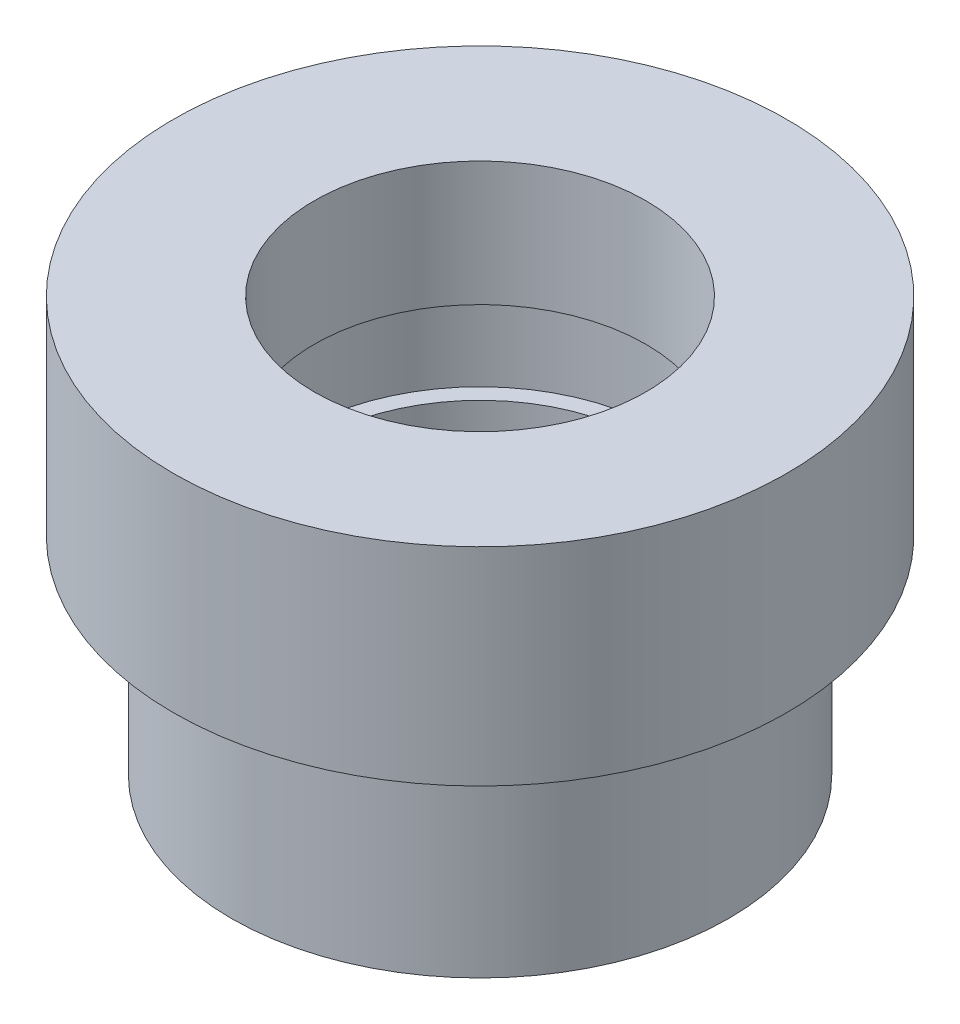
ISO-10303-21;
HEADER;
FILE_DESCRIPTION(('STEP AP214'),'2;1');
FILE_NAME('part.step','',(''),(''),'','','');
FILE_SCHEMA(('AUTOMOTIVE_DESIGN { 1 0 10303 214 1 1 1 1 }'));
ENDSEC;
DATA;
#1=APPLICATION_CONTEXT('core data for automotive mechanical design processes');
#2=APPLICATION_PROTOCOL_DEFINITION('international standard','automotive_design',2000,#1);
#3=PRODUCT_CONTEXT('',#1,'mechanical');
#4=PRODUCT('Part','Part','',(#3));
#5=PRODUCT_RELATED_PRODUCT_CATEGORY('part','',(#4));
#6=PRODUCT_DEFINITION_FORMATION('','',#4);
#7=PRODUCT_DEFINITION_CONTEXT('part definition',#1,'design');
#8=PRODUCT_DEFINITION('design','',#6,#7);
#9=PRODUCT_DEFINITION_SHAPE('','',#8);
#10=(LENGTH_UNIT() NAMED_UNIT(*) SI_UNIT(.MILLI.,.METRE.));
#11=(NAMED_UNIT(*) PLANE_ANGLE_UNIT() SI_UNIT($,.RADIAN.));
#12=(NAMED_UNIT(*) SI_UNIT($,.STERADIAN.) SOLID_ANGLE_UNIT());
#13=UNCERTAINTY_MEASURE_WITH_UNIT(LENGTH_MEASURE(1.E-05),#10,'distance_accuracy_value','');
#14=(GEOMETRIC_REPRESENTATION_CONTEXT(3) GLOBAL_UNCERTAINTY_ASSIGNED_CONTEXT((#13)) GLOBAL_UNIT_ASSIGNED_CONTEXT((#10,
#11,#12)) REPRESENTATION_CONTEXT('',''));
#15=CARTESIAN_POINT('',(0.,0.,0.));
#16=DIRECTION('',(0.,0.,1.));
#17=DIRECTION('',(1.,0.,0.));
#18=AXIS2_PLACEMENT_3D('',#15,#16,#17);
#19=CARTESIAN_POINT('',(30.,25.,-2.09488880330588E-13));
#20=DIRECTION('',(0.,1.,0.));
#21=DIRECTION('',(0.,0.,1.));
#22=AXIS2_PLACEMENT_3D('',#19,#20,#21);
#23=PLANE('',#22);
#24=CARTESIAN_POINT('',(0.,25.,0.));
#25=DIRECTION('',(0.,1.,0.));
#26=DIRECTION('',(0.,0.,1.));
#27=AXIS2_PLACEMENT_3D('',#24,#25,#26);
#28=CIRCLE('',#27,37.);
#29=CARTESIAN_POINT('',(0.,25.,37.));
#30=VERTEX_POINT('',#29);
#31=EDGE_CURVE('E10',#30,#30,#28,.T.);
#32=ORIENTED_EDGE('',*,*,#31,.F.);
#33=EDGE_LOOP('',(#32));
#34=FACE_BOUND('',#33,.T.);
#35=CARTESIAN_POINT('',(0.,25.,0.));
#36=DIRECTION('',(0.,1.,0.));
#37=DIRECTION('',(0.,0.,1.));
#38=AXIS2_PLACEMENT_3D('',#35,#36,#37);
#39=CIRCLE('',#38,30.);
#40=CARTESIAN_POINT('',(0.,25.,30.));
#41=VERTEX_POINT('',#40);
#42=EDGE_CURVE('E80',#41,#41,#39,.T.);
#43=ORIENTED_EDGE('',*,*,#42,.T.);
#44=EDGE_LOOP('',(#43));
#45=FACE_BOUND('',#44,.T.);
#46=ADVANCED_FACE('F37',(#34,#45),#23,.F.);
#47=CARTESIAN_POINT('',(0.,23.7378640776699,0.));
#48=DIRECTION('',(0.,1.,0.));
#49=DIRECTION('',(0.,0.,1.));
#50=AXIS2_PLACEMENT_3D('',#47,#48,#49);
#51=CYLINDRICAL_SURFACE('',#50,37.);
#52=CARTESIAN_POINT('',(0.,50.,0.));
#53=DIRECTION('',(0.,1.,0.));
#54=DIRECTION('',(0.,0.,1.));
#55=AXIS2_PLACEMENT_3D('',#52,#53,#54);
#56=CIRCLE('',#55,37.);
#57=CARTESIAN_POINT('',(0.,50.,37.));
#58=VERTEX_POINT('',#57);
#59=EDGE_CURVE('E44',#58,#58,#56,.T.);
#60=ORIENTED_EDGE('',*,*,#59,.F.);
#61=EDGE_LOOP('',(#60));
#62=FACE_BOUND('',#61,.T.);
#63=ORIENTED_EDGE('',*,*,#31,.T.);
#64=EDGE_LOOP('',(#63));
#65=FACE_BOUND('',#64,.T.);
#66=ADVANCED_FACE('F130',(#62,#65),#51,.T.);
#67=CARTESIAN_POINT('',(37.,50.,-2.58369619074392E-13));
#68=DIRECTION('',(0.,-1.,0.));
#69=DIRECTION('',(0.,0.,-1.));
#70=AXIS2_PLACEMENT_3D('',#67,#68,#69);
#71=PLANE('',#70);
#72=CARTESIAN_POINT('',(0.,50.,0.));
#73=DIRECTION('',(0.,1.,0.));
#74=DIRECTION('',(0.,0.,1.));
#75=AXIS2_PLACEMENT_3D('',#72,#73,#74);
#76=CIRCLE('',#75,20.);
#77=CARTESIAN_POINT('',(0.,50.,20.));
#78=VERTEX_POINT('',#77);
#79=EDGE_CURVE('E49',#78,#78,#76,.T.);
#80=ORIENTED_EDGE('',*,*,#79,.F.);
#81=EDGE_LOOP('',(#80));
#82=FACE_BOUND('',#81,.T.);
#83=ORIENTED_EDGE('',*,*,#59,.T.);
#84=EDGE_LOOP('',(#83));
#85=FACE_BOUND('',#84,.T.);
#86=ADVANCED_FACE('F125',(#82,#85),#71,.F.);
#87=CARTESIAN_POINT('',(0.,23.7378640776699,0.));
#88=DIRECTION('',(0.,1.,0.));
#89=DIRECTION('',(0.,0.,1.));
#90=AXIS2_PLACEMENT_3D('',#87,#88,#89);
#91=CYLINDRICAL_SURFACE('',#90,20.);
#92=CARTESIAN_POINT('',(0.,35.,0.));
#93=DIRECTION('',(0.,1.,0.));
#94=DIRECTION('',(0.,0.,1.));
#95=AXIS2_PLACEMENT_3D('',#92,#93,#94);
#96=CIRCLE('',#95,20.);
#97=CARTESIAN_POINT('',(0.,35.,20.));
#98=VERTEX_POINT('',#97);
#99=EDGE_CURVE('E54',#98,#98,#96,.T.);
#100=ORIENTED_EDGE('',*,*,#99,.F.);
#101=EDGE_LOOP('',(#100));
#102=FACE_BOUND('',#101,.T.);
#103=ORIENTED_EDGE('',*,*,#79,.T.);
#104=EDGE_LOOP('',(#103));
#105=FACE_BOUND('',#104,.T.);
#106=ADVANCED_FACE('F119',(#102,#105),#91,.F.);
#107=CARTESIAN_POINT('',(20.,35.,-1.39659253553725E-13));
#108=DIRECTION('',(0.,1.,0.));
#109=DIRECTION('',(0.,0.,1.));
#110=AXIS2_PLACEMENT_3D('',#107,#108,#109);
#111=PLANE('',#110);
#112=CARTESIAN_POINT('',(0.,35.,0.));
#113=DIRECTION('',(0.,1.,0.));
#114=DIRECTION('',(0.,0.,1.));
#115=AXIS2_PLACEMENT_3D('',#112,#113,#114);
#116=CIRCLE('',#115,22.);
#117=CARTESIAN_POINT('',(0.,35.,22.));
#118=VERTEX_POINT('',#117);
#119=EDGE_CURVE('E60',#118,#118,#116,.T.);
#120=ORIENTED_EDGE('',*,*,#119,.F.);
#121=EDGE_LOOP('',(#120));
#122=FACE_BOUND('',#121,.T.);
#123=ORIENTED_EDGE('',*,*,#99,.T.);
#124=EDGE_LOOP('',(#123));
#125=FACE_BOUND('',#124,.T.);
#126=ADVANCED_FACE('F113',(#122,#125),#111,.F.);
#127=CARTESIAN_POINT('',(0.,23.7378640776699,0.));
#128=DIRECTION('',(0.,1.,0.));
#129=DIRECTION('',(0.,0.,1.));
#130=AXIS2_PLACEMENT_3D('',#127,#128,#129);
#131=CYLINDRICAL_SURFACE('',#130,22.);
#132=CARTESIAN_POINT('',(0.,25.,0.));
#133=DIRECTION('',(0.,1.,0.));
#134=DIRECTION('',(0.,0.,1.));
#135=AXIS2_PLACEMENT_3D('',#132,#133,#134);
#136=CIRCLE('',#135,22.);
#137=CARTESIAN_POINT('',(0.,25.,22.));
#138=VERTEX_POINT('',#137);
#139=EDGE_CURVE('E64',#138,#138,#136,.T.);
#140=ORIENTED_EDGE('',*,*,#139,.F.);
#141=EDGE_LOOP('',(#140));
#142=FACE_BOUND('',#141,.T.);
#143=ORIENTED_EDGE('',*,*,#119,.T.);
#144=EDGE_LOOP('',(#143));
#145=FACE_BOUND('',#144,.T.);
#146=ADVANCED_FACE('F107',(#142,#145),#131,.F.);
#147=CARTESIAN_POINT('',(22.,25.,-1.53625178909098E-13));
#148=DIRECTION('',(0.,-1.,0.));
#149=DIRECTION('',(0.,0.,-1.));
#150=AXIS2_PLACEMENT_3D('',#147,#148,#149);
#151=PLANE('',#150);
#152=CARTESIAN_POINT('',(0.,25.,0.));
#153=DIRECTION('',(0.,1.,0.));
#154=DIRECTION('',(0.,0.,1.));
#155=AXIS2_PLACEMENT_3D('',#152,#153,#154);
#156=CIRCLE('',#155,20.);
#157=CARTESIAN_POINT('',(0.,25.,20.));
#158=VERTEX_POINT('',#157);
#159=EDGE_CURVE('E68',#158,#158,#156,.T.);
#160=ORIENTED_EDGE('',*,*,#159,.F.);
#161=EDGE_LOOP('',(#160));
#162=FACE_BOUND('',#161,.T.);
#163=ORIENTED_EDGE('',*,*,#139,.T.);
#164=EDGE_LOOP('',(#163));
#165=FACE_BOUND('',#164,.T.);
#166=ADVANCED_FACE('F101',(#162,#165),#151,.F.);
#167=CARTESIAN_POINT('',(0.,23.7378640776699,0.));
#168=DIRECTION('',(0.,1.,0.));
#169=DIRECTION('',(0.,0.,1.));
#170=AXIS2_PLACEMENT_3D('',#167,#168,#169);
#171=CYLINDRICAL_SURFACE('',#170,20.);
#172=CARTESIAN_POINT('',(0.,0.,0.));
#173=DIRECTION('',(0.,1.,0.));
#174=DIRECTION('',(0.,0.,1.));
#175=AXIS2_PLACEMENT_3D('',#172,#173,#174);
#176=CIRCLE('',#175,20.);
#177=CARTESIAN_POINT('',(0.,0.,20.));
#178=VERTEX_POINT('',#177);
#179=EDGE_CURVE('E72',#178,#178,#176,.T.);
#180=ORIENTED_EDGE('',*,*,#179,.F.);
#181=EDGE_LOOP('',(#180));
#182=FACE_BOUND('',#181,.T.);
#183=ORIENTED_EDGE('',*,*,#159,.T.);
#184=EDGE_LOOP('',(#183));
#185=FACE_BOUND('',#184,.T.);
#186=ADVANCED_FACE('F95',(#182,#185),#171,.F.);
#187=CARTESIAN_POINT('',(20.,0.,-1.39659253553725E-13));
#188=DIRECTION('',(0.,1.,0.));
#189=DIRECTION('',(0.,0.,1.));
#190=AXIS2_PLACEMENT_3D('',#187,#188,#189);
#191=PLANE('',#190);
#192=CARTESIAN_POINT('',(0.,0.,0.));
#193=DIRECTION('',(0.,1.,0.));
#194=DIRECTION('',(0.,0.,1.));
#195=AXIS2_PLACEMENT_3D('',#192,#193,#194);
#196=CIRCLE('',#195,30.);
#197=CARTESIAN_POINT('',(0.,0.,30.));
#198=VERTEX_POINT('',#197);
#199=EDGE_CURVE('E76',#198,#198,#196,.T.);
#200=ORIENTED_EDGE('',*,*,#199,.F.);
#201=EDGE_LOOP('',(#200));
#202=FACE_BOUND('',#201,.T.);
#203=ORIENTED_EDGE('',*,*,#179,.T.);
#204=EDGE_LOOP('',(#203));
#205=FACE_BOUND('',#204,.T.);
#206=ADVANCED_FACE('F89',(#202,#205),#191,.F.);
#207=CARTESIAN_POINT('',(0.,23.7378640776699,0.));
#208=DIRECTION('',(0.,1.,0.));
#209=DIRECTION('',(0.,0.,1.));
#210=AXIS2_PLACEMENT_3D('',#207,#208,#209);
#211=CYLINDRICAL_SURFACE('',#210,30.);
#212=ORIENTED_EDGE('',*,*,#42,.F.);
#213=EDGE_LOOP('',(#212));
#214=FACE_BOUND('',#213,.T.);
#215=ORIENTED_EDGE('',*,*,#199,.T.);
#216=EDGE_LOOP('',(#215));
#217=FACE_BOUND('',#216,.T.);
#218=ADVANCED_FACE('F86',(#214,#217),#211,.T.);
#219=CLOSED_SHELL('',(#46,#66,#86,#106,#126,#146,#166,#186,#206,#218));
#220=MANIFOLD_SOLID_BREP('B2',#219);
#221=ADVANCED_BREP_SHAPE_REPRESENTATION('',(#18,#220),#14);
#222=SHAPE_DEFINITION_REPRESENTATION(#9,#221);
ENDSEC;
END-ISO-10303-21;
